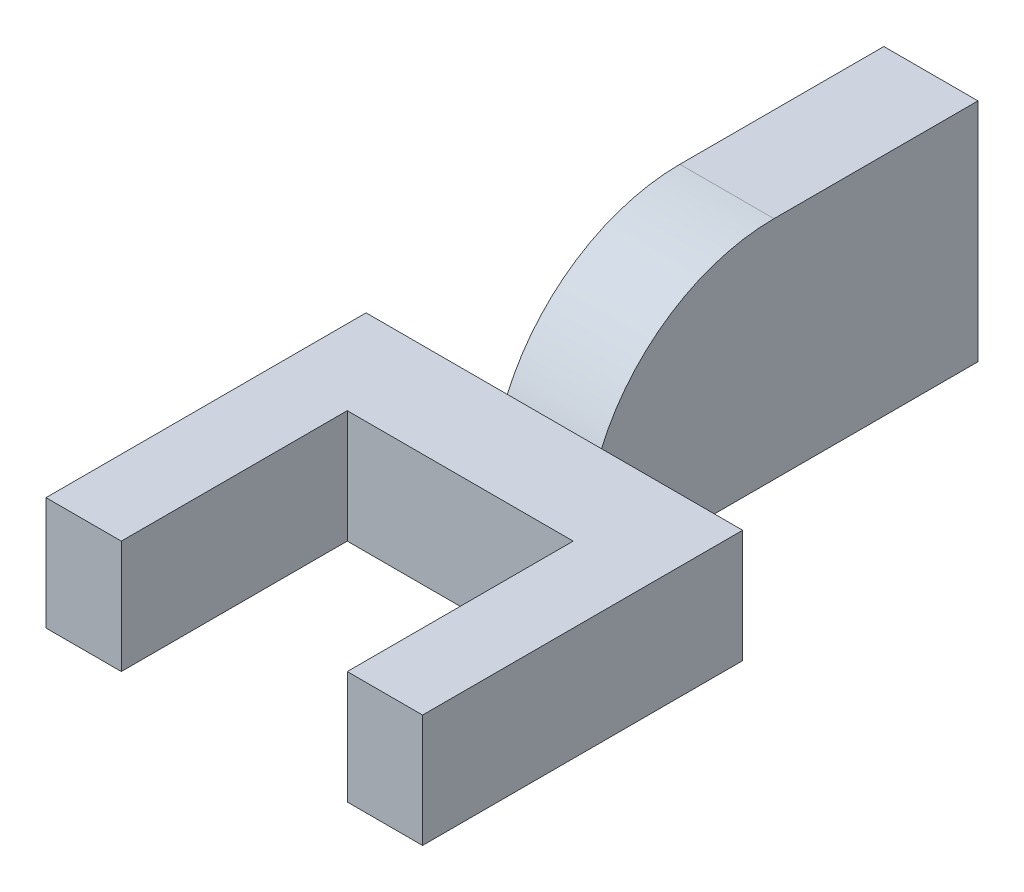
ISO-10303-21;
HEADER;
FILE_DESCRIPTION(('STEP AP214'),'2;1');
FILE_NAME('part.step','',(''),(''),'','','');
FILE_SCHEMA(('AUTOMOTIVE_DESIGN { 1 0 10303 214 1 1 1 1 }'));
ENDSEC;
DATA;
#1=APPLICATION_CONTEXT('core data for automotive mechanical design processes');
#2=APPLICATION_PROTOCOL_DEFINITION('international standard','automotive_design',2000,#1);
#3=PRODUCT_CONTEXT('',#1,'mechanical');
#4=PRODUCT('Part','Part','',(#3));
#5=PRODUCT_RELATED_PRODUCT_CATEGORY('part','',(#4));
#6=PRODUCT_DEFINITION_FORMATION('','',#4);
#7=PRODUCT_DEFINITION_CONTEXT('part definition',#1,'design');
#8=PRODUCT_DEFINITION('design','',#6,#7);
#9=PRODUCT_DEFINITION_SHAPE('','',#8);
#10=(LENGTH_UNIT() NAMED_UNIT(*) SI_UNIT(.MILLI.,.METRE.));
#11=(NAMED_UNIT(*) PLANE_ANGLE_UNIT() SI_UNIT($,.RADIAN.));
#12=(NAMED_UNIT(*) SI_UNIT($,.STERADIAN.) SOLID_ANGLE_UNIT());
#13=UNCERTAINTY_MEASURE_WITH_UNIT(LENGTH_MEASURE(1.E-05),#10,'distance_accuracy_value','');
#14=(GEOMETRIC_REPRESENTATION_CONTEXT(3) GLOBAL_UNCERTAINTY_ASSIGNED_CONTEXT((#13)) GLOBAL_UNIT_ASSIGNED_CONTEXT((#10,
#11,#12)) REPRESENTATION_CONTEXT('',''));
#15=CARTESIAN_POINT('',(0.,0.,0.));
#16=DIRECTION('',(0.,0.,1.));
#17=DIRECTION('',(1.,0.,0.));
#18=AXIS2_PLACEMENT_3D('',#15,#16,#17);
#19=CARTESIAN_POINT('',(0.,12.,-16.25));
#20=DIRECTION('',(0.,0.,-1.));
#21=DIRECTION('',(-1.,0.,0.));
#22=AXIS2_PLACEMENT_3D('',#19,#20,#21);
#23=PLANE('',#22);
#24=DIRECTION('',(1.,0.,0.));
#25=VECTOR('',#24,1.);
#26=CARTESIAN_POINT('',(-10.,6.,-16.25));
#27=LINE('',#26,#25);
#28=CARTESIAN_POINT('',(2.5,6.,-16.25));
#29=VERTEX_POINT('',#28);
#30=CARTESIAN_POINT('',(9.99999999999999,6.,-16.25));
#31=VERTEX_POINT('',#30);
#32=EDGE_CURVE('E155',#29,#31,#27,.T.);
#33=ORIENTED_EDGE('',*,*,#32,.T.);
#34=DIRECTION('',(0.,-1.,0.));
#35=VECTOR('',#34,1.);
#36=CARTESIAN_POINT('',(9.99999999999999,12.,-16.25));
#37=LINE('',#36,#35);
#38=CARTESIAN_POINT('',(9.99999999999999,0.,-16.25));
#39=VERTEX_POINT('',#38);
#40=EDGE_CURVE('E166',#31,#39,#37,.T.);
#41=ORIENTED_EDGE('',*,*,#40,.T.);
#42=DIRECTION('',(1.,0.,0.));
#43=VECTOR('',#42,1.);
#44=CARTESIAN_POINT('',(0.,0.,-16.25));
#45=LINE('',#44,#43);
#46=CARTESIAN_POINT('',(2.5,0.,-16.25));
#47=VERTEX_POINT('',#46);
#48=EDGE_CURVE('E197',#47,#39,#45,.T.);
#49=ORIENTED_EDGE('',*,*,#48,.F.);
#50=DIRECTION('',(0.,1.,0.));
#51=VECTOR('',#50,1.);
#52=CARTESIAN_POINT('',(2.5,0.,-16.25));
#53=LINE('',#52,#51);
#54=EDGE_CURVE('E183',#47,#29,#53,.T.);
#55=ORIENTED_EDGE('',*,*,#54,.T.);
#56=EDGE_LOOP('',(#33,#41,#49,#55));
#57=FACE_BOUND('',#56,.T.);
#58=ADVANCED_FACE('F39',(#57),#23,.T.);
#59=CARTESIAN_POINT('',(10.,12.,0.));
#60=DIRECTION('',(1.,0.,0.));
#61=DIRECTION('',(0.,0.,-1.));
#62=AXIS2_PLACEMENT_3D('',#59,#60,#61);
#63=PLANE('',#62);
#64=DIRECTION('',(0.,0.,-1.));
#65=VECTOR('',#64,1.);
#66=CARTESIAN_POINT('',(10.,6.,0.));
#67=LINE('',#66,#65);
#68=CARTESIAN_POINT('',(10.,6.,0.75));
#69=VERTEX_POINT('',#68);
#70=EDGE_CURVE('E190',#69,#31,#67,.T.);
#71=ORIENTED_EDGE('',*,*,#70,.F.);
#72=DIRECTION('',(0.,-1.,0.));
#73=VECTOR('',#72,1.);
#74=CARTESIAN_POINT('',(10.,12.,0.750000000000001));
#75=LINE('',#74,#73);
#76=CARTESIAN_POINT('',(10.,0.,0.750000000000001));
#77=VERTEX_POINT('',#76);
#78=EDGE_CURVE('E270',#69,#77,#75,.T.);
#79=ORIENTED_EDGE('',*,*,#78,.T.);
#80=DIRECTION('',(0.,0.,1.));
#81=VECTOR('',#80,1.);
#82=CARTESIAN_POINT('',(10.,0.,0.));
#83=LINE('',#82,#81);
#84=EDGE_CURVE('E199',#39,#77,#83,.T.);
#85=ORIENTED_EDGE('',*,*,#84,.F.);
#86=ORIENTED_EDGE('',*,*,#40,.F.);
#87=EDGE_LOOP('',(#71,#79,#85,#86));
#88=FACE_BOUND('',#87,.T.);
#89=ADVANCED_FACE('F304',(#88),#63,.T.);
#90=CARTESIAN_POINT('',(-10.,6.,-16.25));
#91=VERTEX_POINT('',#90);
#92=CARTESIAN_POINT('',(-2.5,6.,-16.25));
#93=VERTEX_POINT('',#92);
#94=EDGE_CURVE('E140',#91,#93,#27,.T.);
#95=ORIENTED_EDGE('',*,*,#94,.T.);
#96=DIRECTION('',(0.,1.,0.));
#97=VECTOR('',#96,1.);
#98=CARTESIAN_POINT('',(-2.5,0.,-16.25));
#99=LINE('',#98,#97);
#100=CARTESIAN_POINT('',(-2.5,0.,-16.25));
#101=VERTEX_POINT('',#100);
#102=EDGE_CURVE('E200',#101,#93,#99,.T.);
#103=ORIENTED_EDGE('',*,*,#102,.F.);
#104=CARTESIAN_POINT('',(-10.,0.,-16.25));
#105=VERTEX_POINT('',#104);
#106=EDGE_CURVE('E248',#105,#101,#45,.T.);
#107=ORIENTED_EDGE('',*,*,#106,.F.);
#108=DIRECTION('',(0.,-1.,0.));
#109=VECTOR('',#108,1.);
#110=CARTESIAN_POINT('',(-10.,12.,-16.25));
#111=LINE('',#110,#109);
#112=EDGE_CURVE('E162',#91,#105,#111,.T.);
#113=ORIENTED_EDGE('',*,*,#112,.F.);
#114=EDGE_LOOP('',(#95,#103,#107,#113));
#115=FACE_BOUND('',#114,.T.);
#116=ADVANCED_FACE('F295',(#115),#23,.T.);
#117=CARTESIAN_POINT('',(-10.,12.,0.));
#118=DIRECTION('',(1.,0.,0.));
#119=DIRECTION('',(0.,0.,-1.));
#120=AXIS2_PLACEMENT_3D('',#117,#118,#119);
#121=PLANE('',#120);
#122=DIRECTION('',(0.,-1.,0.));
#123=VECTOR('',#122,1.);
#124=CARTESIAN_POINT('',(-10.,12.,0.750000000000001));
#125=LINE('',#124,#123);
#126=CARTESIAN_POINT('',(-10.,6.,0.750000000000004));
#127=VERTEX_POINT('',#126);
#128=CARTESIAN_POINT('',(-10.,0.,0.750000000000001));
#129=VERTEX_POINT('',#128);
#130=EDGE_CURVE('E151',#127,#129,#125,.T.);
#131=ORIENTED_EDGE('',*,*,#130,.F.);
#132=DIRECTION('',(0.,0.,-1.));
#133=VECTOR('',#132,1.);
#134=CARTESIAN_POINT('',(-10.,6.,0.750000000000004));
#135=LINE('',#134,#133);
#136=EDGE_CURVE('E134',#127,#91,#135,.T.);
#137=ORIENTED_EDGE('',*,*,#136,.T.);
#138=ORIENTED_EDGE('',*,*,#112,.T.);
#139=DIRECTION('',(0.,0.,1.));
#140=VECTOR('',#139,1.);
#141=CARTESIAN_POINT('',(-10.,0.,0.));
#142=LINE('',#141,#140);
#143=EDGE_CURVE('E159',#105,#129,#142,.T.);
#144=ORIENTED_EDGE('',*,*,#143,.T.);
#145=EDGE_LOOP('',(#131,#137,#138,#144));
#146=FACE_BOUND('',#145,.T.);
#147=ADVANCED_FACE('F157',(#146),#121,.F.);
#148=CARTESIAN_POINT('',(0.,12.,0.750000000000001));
#149=DIRECTION('',(0.,0.,-1.));
#150=DIRECTION('',(-1.,0.,0.));
#151=AXIS2_PLACEMENT_3D('',#148,#149,#150);
#152=PLANE('',#151);
#153=DIRECTION('',(0.,-1.,0.));
#154=VECTOR('',#153,1.);
#155=CARTESIAN_POINT('',(-6.,12.,0.750000000000001));
#156=LINE('',#155,#154);
#157=CARTESIAN_POINT('',(-6.,6.,0.750000000000003));
#158=VERTEX_POINT('',#157);
#159=CARTESIAN_POINT('',(-6.,0.,0.750000000000001));
#160=VERTEX_POINT('',#159);
#161=EDGE_CURVE('E153',#158,#160,#156,.T.);
#162=ORIENTED_EDGE('',*,*,#161,.F.);
#163=DIRECTION('',(1.,0.,0.));
#164=VECTOR('',#163,1.);
#165=CARTESIAN_POINT('',(-10.,6.,0.750000000000004));
#166=LINE('',#165,#164);
#167=EDGE_CURVE('E137',#127,#158,#166,.T.);
#168=ORIENTED_EDGE('',*,*,#167,.F.);
#169=ORIENTED_EDGE('',*,*,#130,.T.);
#170=DIRECTION('',(1.,0.,0.));
#171=VECTOR('',#170,1.);
#172=CARTESIAN_POINT('',(0.,0.,0.750000000000001));
#173=LINE('',#172,#171);
#174=EDGE_CURVE('E254',#129,#160,#173,.T.);
#175=ORIENTED_EDGE('',*,*,#174,.T.);
#176=EDGE_LOOP('',(#162,#168,#169,#175));
#177=FACE_BOUND('',#176,.T.);
#178=ADVANCED_FACE('F149',(#177),#152,.F.);
#179=CARTESIAN_POINT('',(-6.,12.,0.));
#180=DIRECTION('',(1.,0.,0.));
#181=DIRECTION('',(0.,0.,-1.));
#182=AXIS2_PLACEMENT_3D('',#179,#180,#181);
#183=PLANE('',#182);
#184=DIRECTION('',(0.,0.,-1.));
#185=VECTOR('',#184,1.);
#186=CARTESIAN_POINT('',(-6.,6.,0.));
#187=LINE('',#186,#185);
#188=CARTESIAN_POINT('',(-6.,6.,-11.25));
#189=VERTEX_POINT('',#188);
#190=EDGE_CURVE('E213',#158,#189,#187,.T.);
#191=ORIENTED_EDGE('',*,*,#190,.F.);
#192=ORIENTED_EDGE('',*,*,#161,.T.);
#193=DIRECTION('',(0.,0.,1.));
#194=VECTOR('',#193,1.);
#195=CARTESIAN_POINT('',(-6.,0.,0.));
#196=LINE('',#195,#194);
#197=CARTESIAN_POINT('',(-6.,0.,-11.25));
#198=VERTEX_POINT('',#197);
#199=EDGE_CURVE('E257',#198,#160,#196,.T.);
#200=ORIENTED_EDGE('',*,*,#199,.F.);
#201=DIRECTION('',(0.,-1.,0.));
#202=VECTOR('',#201,1.);
#203=CARTESIAN_POINT('',(-6.,12.,-11.25));
#204=LINE('',#203,#202);
#205=EDGE_CURVE('E168',#189,#198,#204,.T.);
#206=ORIENTED_EDGE('',*,*,#205,.F.);
#207=EDGE_LOOP('',(#191,#192,#200,#206));
#208=FACE_BOUND('',#207,.T.);
#209=ADVANCED_FACE('F290',(#208),#183,.T.);
#210=CARTESIAN_POINT('',(0.,12.,-11.25));
#211=DIRECTION('',(0.,0.,-1.));
#212=DIRECTION('',(-1.,0.,0.));
#213=AXIS2_PLACEMENT_3D('',#210,#211,#212);
#214=PLANE('',#213);
#215=DIRECTION('',(0.,-1.,0.));
#216=VECTOR('',#215,1.);
#217=CARTESIAN_POINT('',(6.,12.,-11.25));
#218=LINE('',#217,#216);
#219=CARTESIAN_POINT('',(6.,6.,-11.25));
#220=VERTEX_POINT('',#219);
#221=CARTESIAN_POINT('',(6.,0.,-11.25));
#222=VERTEX_POINT('',#221);
#223=EDGE_CURVE('E276',#220,#222,#218,.T.);
#224=ORIENTED_EDGE('',*,*,#223,.F.);
#225=DIRECTION('',(-1.,0.,0.));
#226=VECTOR('',#225,1.);
#227=CARTESIAN_POINT('',(0.,6.,-11.25));
#228=LINE('',#227,#226);
#229=EDGE_CURVE('E209',#220,#189,#228,.T.);
#230=ORIENTED_EDGE('',*,*,#229,.T.);
#231=ORIENTED_EDGE('',*,*,#205,.T.);
#232=DIRECTION('',(1.,0.,0.));
#233=VECTOR('',#232,1.);
#234=CARTESIAN_POINT('',(0.,0.,-11.25));
#235=LINE('',#234,#233);
#236=EDGE_CURVE('E262',#198,#222,#235,.T.);
#237=ORIENTED_EDGE('',*,*,#236,.T.);
#238=EDGE_LOOP('',(#224,#230,#231,#237));
#239=FACE_BOUND('',#238,.T.);
#240=ADVANCED_FACE('F283',(#239),#214,.F.);
#241=CARTESIAN_POINT('',(6.,12.,0.));
#242=DIRECTION('',(1.,0.,0.));
#243=DIRECTION('',(0.,0.,-1.));
#244=AXIS2_PLACEMENT_3D('',#241,#242,#243);
#245=PLANE('',#244);
#246=DIRECTION('',(0.,-1.,0.));
#247=VECTOR('',#246,1.);
#248=CARTESIAN_POINT('',(6.,12.,0.750000000000001));
#249=LINE('',#248,#247);
#250=CARTESIAN_POINT('',(6.,6.,0.750000000000001));
#251=VERTEX_POINT('',#250);
#252=CARTESIAN_POINT('',(6.,0.,0.750000000000001));
#253=VERTEX_POINT('',#252);
#254=EDGE_CURVE('E273',#251,#253,#249,.T.);
#255=ORIENTED_EDGE('',*,*,#254,.F.);
#256=DIRECTION('',(0.,0.,-1.));
#257=VECTOR('',#256,1.);
#258=CARTESIAN_POINT('',(6.,6.,0.));
#259=LINE('',#258,#257);
#260=EDGE_CURVE('E204',#251,#220,#259,.T.);
#261=ORIENTED_EDGE('',*,*,#260,.T.);
#262=ORIENTED_EDGE('',*,*,#223,.T.);
#263=DIRECTION('',(0.,0.,1.));
#264=VECTOR('',#263,1.);
#265=CARTESIAN_POINT('',(6.,0.,0.));
#266=LINE('',#265,#264);
#267=EDGE_CURVE('E266',#222,#253,#266,.T.);
#268=ORIENTED_EDGE('',*,*,#267,.T.);
#269=EDGE_LOOP('',(#255,#261,#262,#268));
#270=FACE_BOUND('',#269,.T.);
#271=ADVANCED_FACE('F313',(#270),#245,.F.);
#272=ORIENTED_EDGE('',*,*,#78,.F.);
#273=EDGE_CURVE('E145',#251,#69,#166,.T.);
#274=ORIENTED_EDGE('',*,*,#273,.F.);
#275=ORIENTED_EDGE('',*,*,#254,.T.);
#276=EDGE_CURVE('E258',#253,#77,#173,.T.);
#277=ORIENTED_EDGE('',*,*,#276,.T.);
#278=EDGE_LOOP('',(#272,#274,#275,#277));
#279=FACE_BOUND('',#278,.T.);
#280=ADVANCED_FACE('F309',(#279),#152,.F.);
#281=CARTESIAN_POINT('',(0.,12.,0.));
#282=DIRECTION('',(0.,1.,0.));
#283=DIRECTION('',(0.,0.,1.));
#284=AXIS2_PLACEMENT_3D('',#281,#282,#283);
#285=PLANE('',#284);
#286=DIRECTION('',(0.,0.,1.));
#287=VECTOR('',#286,1.);
#288=CARTESIAN_POINT('',(-2.5,12.,-36.25));
#289=LINE('',#288,#287);
#290=CARTESIAN_POINT('',(-2.5,12.,-36.25));
#291=VERTEX_POINT('',#290);
#292=CARTESIAN_POINT('',(-2.5,12.,-25.4151513899117));
#293=VERTEX_POINT('',#292);
#294=EDGE_CURVE('E222',#291,#293,#289,.T.);
#295=ORIENTED_EDGE('',*,*,#294,.T.);
#296=DIRECTION('',(1.,0.,0.));
#297=VECTOR('',#296,1.);
#298=CARTESIAN_POINT('',(2.5,12.,-25.4151513899117));
#299=LINE('',#298,#297);
#300=CARTESIAN_POINT('',(2.5,12.,-25.4151513899117));
#301=VERTEX_POINT('',#300);
#302=EDGE_CURVE('E174',#293,#301,#299,.T.);
#303=ORIENTED_EDGE('',*,*,#302,.T.);
#304=DIRECTION('',(0.,0.,-1.));
#305=VECTOR('',#304,1.);
#306=CARTESIAN_POINT('',(2.5,12.,-36.25));
#307=LINE('',#306,#305);
#308=CARTESIAN_POINT('',(2.5,12.,-36.25));
#309=VERTEX_POINT('',#308);
#310=EDGE_CURVE('E186',#301,#309,#307,.T.);
#311=ORIENTED_EDGE('',*,*,#310,.T.);
#312=DIRECTION('',(-1.,0.,0.));
#313=VECTOR('',#312,1.);
#314=CARTESIAN_POINT('',(-2.5,12.,-36.25));
#315=LINE('',#314,#313);
#316=EDGE_CURVE('E232',#309,#291,#315,.T.);
#317=ORIENTED_EDGE('',*,*,#316,.T.);
#318=EDGE_LOOP('',(#295,#303,#311,#317));
#319=FACE_BOUND('',#318,.T.);
#320=ADVANCED_FACE('F321',(#319),#285,.T.);
#321=CARTESIAN_POINT('',(0.,0.,0.));
#322=DIRECTION('',(0.,1.,0.));
#323=DIRECTION('',(0.,0.,1.));
#324=AXIS2_PLACEMENT_3D('',#321,#322,#323);
#325=PLANE('',#324);
#326=ORIENTED_EDGE('',*,*,#84,.T.);
#327=ORIENTED_EDGE('',*,*,#276,.F.);
#328=ORIENTED_EDGE('',*,*,#267,.F.);
#329=ORIENTED_EDGE('',*,*,#236,.F.);
#330=ORIENTED_EDGE('',*,*,#199,.T.);
#331=ORIENTED_EDGE('',*,*,#174,.F.);
#332=ORIENTED_EDGE('',*,*,#143,.F.);
#333=ORIENTED_EDGE('',*,*,#106,.T.);
#334=DIRECTION('',(0.,0.,1.));
#335=VECTOR('',#334,1.);
#336=CARTESIAN_POINT('',(-2.5,0.,-36.25));
#337=LINE('',#336,#335);
#338=CARTESIAN_POINT('',(-2.5,0.,-36.25));
#339=VERTEX_POINT('',#338);
#340=EDGE_CURVE('E226',#339,#101,#337,.T.);
#341=ORIENTED_EDGE('',*,*,#340,.F.);
#342=DIRECTION('',(-1.,0.,0.));
#343=VECTOR('',#342,1.);
#344=CARTESIAN_POINT('',(-2.5,0.,-36.25));
#345=LINE('',#344,#343);
#346=CARTESIAN_POINT('',(2.5,0.,-36.25));
#347=VERTEX_POINT('',#346);
#348=EDGE_CURVE('E221',#347,#339,#345,.T.);
#349=ORIENTED_EDGE('',*,*,#348,.F.);
#350=DIRECTION('',(0.,0.,-1.));
#351=VECTOR('',#350,1.);
#352=CARTESIAN_POINT('',(2.5,0.,-36.25));
#353=LINE('',#352,#351);
#354=EDGE_CURVE('E218',#47,#347,#353,.T.);
#355=ORIENTED_EDGE('',*,*,#354,.F.);
#356=ORIENTED_EDGE('',*,*,#48,.T.);
#357=EDGE_LOOP('',(#326,#327,#328,#329,#330,#331,#332,#333,#341,#349,#355,#356));
#358=FACE_BOUND('',#357,.T.);
#359=ADVANCED_FACE('F288',(#358),#325,.F.);
#360=CARTESIAN_POINT('',(2.5,0.,-36.25));
#361=DIRECTION('',(1.,0.,0.));
#362=DIRECTION('',(0.,0.,-1.));
#363=AXIS2_PLACEMENT_3D('',#360,#361,#362);
#364=PLANE('',#363);
#365=ORIENTED_EDGE('',*,*,#310,.F.);
#366=CARTESIAN_POINT('',(2.5,2.,-25.4151513899117));
#367=DIRECTION('',(1.,0.,0.));
#368=DIRECTION('',(0.,0.,-1.));
#369=AXIS2_PLACEMENT_3D('',#366,#367,#368);
#370=CIRCLE('',#369,10.);
#371=EDGE_CURVE('E48',#301,#29,#370,.T.);
#372=ORIENTED_EDGE('',*,*,#371,.T.);
#373=ORIENTED_EDGE('',*,*,#54,.F.);
#374=ORIENTED_EDGE('',*,*,#354,.T.);
#375=DIRECTION('',(0.,1.,0.));
#376=VECTOR('',#375,1.);
#377=CARTESIAN_POINT('',(2.5,0.,-36.25));
#378=LINE('',#377,#376);
#379=EDGE_CURVE('E229',#347,#309,#378,.T.);
#380=ORIENTED_EDGE('',*,*,#379,.T.);
#381=EDGE_LOOP('',(#365,#372,#373,#374,#380));
#382=FACE_BOUND('',#381,.T.);
#383=ADVANCED_FACE('F180',(#382),#364,.T.);
#384=CARTESIAN_POINT('',(-2.5,0.,-36.25));
#385=DIRECTION('',(-1.,0.,0.));
#386=DIRECTION('',(0.,0.,1.));
#387=AXIS2_PLACEMENT_3D('',#384,#385,#386);
#388=PLANE('',#387);
#389=ORIENTED_EDGE('',*,*,#102,.T.);
#390=CARTESIAN_POINT('',(-2.5,2.,-25.4151513899117));
#391=DIRECTION('',(-1.,0.,0.));
#392=DIRECTION('',(0.,0.,1.));
#393=AXIS2_PLACEMENT_3D('',#390,#391,#392);
#394=CIRCLE('',#393,10.);
#395=EDGE_CURVE('E11',#93,#293,#394,.T.);
#396=ORIENTED_EDGE('',*,*,#395,.T.);
#397=ORIENTED_EDGE('',*,*,#294,.F.);
#398=DIRECTION('',(0.,1.,0.));
#399=VECTOR('',#398,1.);
#400=CARTESIAN_POINT('',(-2.5,0.,-36.25));
#401=LINE('',#400,#399);
#402=EDGE_CURVE('E240',#339,#291,#401,.T.);
#403=ORIENTED_EDGE('',*,*,#402,.F.);
#404=ORIENTED_EDGE('',*,*,#340,.T.);
#405=EDGE_LOOP('',(#389,#396,#397,#403,#404));
#406=FACE_BOUND('',#405,.T.);
#407=ADVANCED_FACE('F296',(#406),#388,.T.);
#408=CARTESIAN_POINT('',(-2.5,0.,-36.25));
#409=DIRECTION('',(0.,0.,-1.));
#410=DIRECTION('',(-1.,0.,0.));
#411=AXIS2_PLACEMENT_3D('',#408,#409,#410);
#412=PLANE('',#411);
#413=ORIENTED_EDGE('',*,*,#316,.F.);
#414=ORIENTED_EDGE('',*,*,#379,.F.);
#415=ORIENTED_EDGE('',*,*,#348,.T.);
#416=ORIENTED_EDGE('',*,*,#402,.T.);
#417=EDGE_LOOP('',(#413,#414,#415,#416));
#418=FACE_BOUND('',#417,.T.);
#419=ADVANCED_FACE('F300',(#418),#412,.T.);
#420=CARTESIAN_POINT('',(-10.,6.,0.750000000000004));
#421=DIRECTION('',(0.,-1.,0.));
#422=DIRECTION('',(0.,0.,-1.));
#423=AXIS2_PLACEMENT_3D('',#420,#421,#422);
#424=PLANE('',#423);
#425=ORIENTED_EDGE('',*,*,#70,.T.);
#426=ORIENTED_EDGE('',*,*,#32,.F.);
#427=EDGE_CURVE('E188',#93,#29,#27,.T.);
#428=ORIENTED_EDGE('',*,*,#427,.F.);
#429=ORIENTED_EDGE('',*,*,#94,.F.);
#430=ORIENTED_EDGE('',*,*,#136,.F.);
#431=ORIENTED_EDGE('',*,*,#167,.T.);
#432=ORIENTED_EDGE('',*,*,#190,.T.);
#433=ORIENTED_EDGE('',*,*,#229,.F.);
#434=ORIENTED_EDGE('',*,*,#260,.F.);
#435=ORIENTED_EDGE('',*,*,#273,.T.);
#436=EDGE_LOOP('',(#425,#426,#428,#429,#430,#431,#432,#433,#434,#435));
#437=FACE_BOUND('',#436,.T.);
#438=ADVANCED_FACE('F136',(#437),#424,.F.);
#439=CARTESIAN_POINT('',(-10.,2.,-25.4151513899117));
#440=DIRECTION('',(-1.,0.,0.));
#441=DIRECTION('',(0.,0.,1.));
#442=AXIS2_PLACEMENT_3D('',#439,#440,#441);
#443=CYLINDRICAL_SURFACE('',#442,10.);
#444=ORIENTED_EDGE('',*,*,#395,.F.);
#445=ORIENTED_EDGE('',*,*,#427,.T.);
#446=ORIENTED_EDGE('',*,*,#371,.F.);
#447=ORIENTED_EDGE('',*,*,#302,.F.);
#448=EDGE_LOOP('',(#444,#445,#446,#447));
#449=FACE_BOUND('',#448,.T.);
#450=ADVANCED_FACE('F41',(#449),#443,.T.);
#451=CLOSED_SHELL('',(#58,#89,#116,#147,#178,#209,#240,#271,#280,#320,#359,#383,#407,#419,#438,#450));
#452=MANIFOLD_SOLID_BREP('B2',#451);
#453=ADVANCED_BREP_SHAPE_REPRESENTATION('',(#18,#452),#14);
#454=SHAPE_DEFINITION_REPRESENTATION(#9,#453);
ENDSEC;
END-ISO-10303-21;
